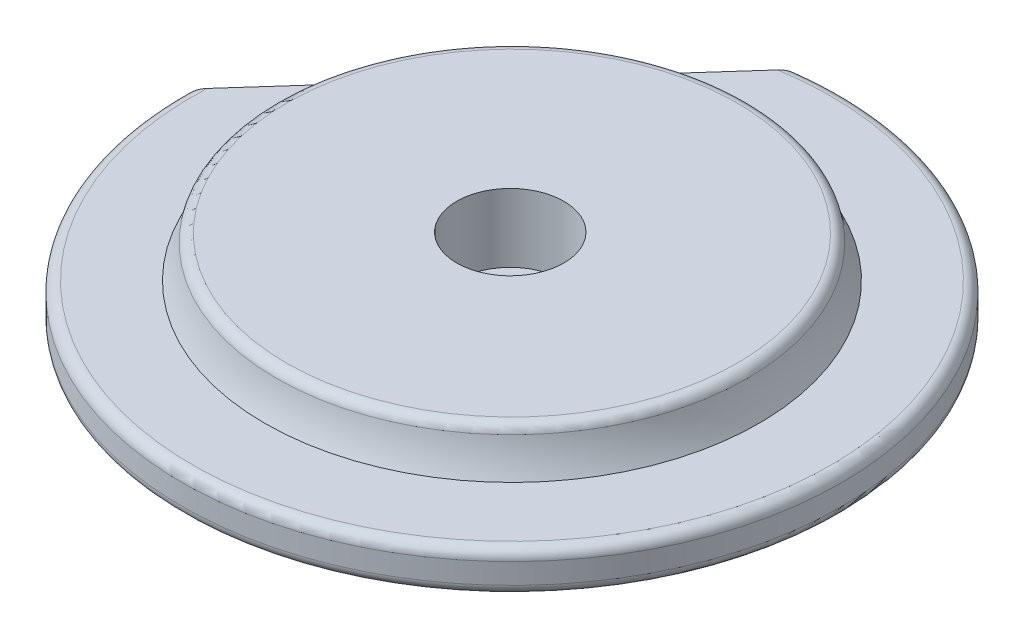
ISO-10303-21;
HEADER;
FILE_DESCRIPTION(('STEP AP214'),'2;1');
FILE_NAME('part.step','',(''),(''),'','','');
FILE_SCHEMA(('AUTOMOTIVE_DESIGN { 1 0 10303 214 1 1 1 1 }'));
ENDSEC;
DATA;
#1=APPLICATION_CONTEXT('core data for automotive mechanical design processes');
#2=APPLICATION_PROTOCOL_DEFINITION('international standard','automotive_design',2000,#1);
#3=PRODUCT_CONTEXT('',#1,'mechanical');
#4=PRODUCT('Part','Part','',(#3));
#5=PRODUCT_RELATED_PRODUCT_CATEGORY('part','',(#4));
#6=PRODUCT_DEFINITION_FORMATION('','',#4);
#7=PRODUCT_DEFINITION_CONTEXT('part definition',#1,'design');
#8=PRODUCT_DEFINITION('design','',#6,#7);
#9=PRODUCT_DEFINITION_SHAPE('','',#8);
#10=(LENGTH_UNIT() NAMED_UNIT(*) SI_UNIT(.MILLI.,.METRE.));
#11=(NAMED_UNIT(*) PLANE_ANGLE_UNIT() SI_UNIT($,.RADIAN.));
#12=(NAMED_UNIT(*) SI_UNIT($,.STERADIAN.) SOLID_ANGLE_UNIT());
#13=UNCERTAINTY_MEASURE_WITH_UNIT(LENGTH_MEASURE(1.E-05),#10,'distance_accuracy_value','');
#14=(GEOMETRIC_REPRESENTATION_CONTEXT(3) GLOBAL_UNCERTAINTY_ASSIGNED_CONTEXT((#13)) GLOBAL_UNIT_ASSIGNED_CONTEXT((#10,
#11,#12)) REPRESENTATION_CONTEXT('',''));
#15=CARTESIAN_POINT('',(0.,0.,0.));
#16=DIRECTION('',(0.,0.,1.));
#17=DIRECTION('',(1.,0.,0.));
#18=AXIS2_PLACEMENT_3D('',#15,#16,#17);
#19=CARTESIAN_POINT('',(81.9281874125754,11.3854877690366,1.71360669660462));
#20=DIRECTION('',(0.,1.,0.));
#21=DIRECTION('',(0.,0.,1.));
#22=AXIS2_PLACEMENT_3D('',#19,#20,#21);
#23=CYLINDRICAL_SURFACE('',#22,20.);
#24=DIRECTION('',(0.,1.,0.));
#25=VECTOR('',#24,1.);
#26=CARTESIAN_POINT('',(79.5576123445659,6.38523776903659,-18.1454057120458));
#27=LINE('',#26,#25);
#28=CARTESIAN_POINT('',(79.5576123445659,7.01048776903659,-18.1454057120458));
#29=VERTEX_POINT('',#28);
#30=CARTESIAN_POINT('',(79.5576123445659,8.26048776903659,-18.1454057120458));
#31=VERTEX_POINT('',#30);
#32=EDGE_CURVE('E85',#29,#31,#27,.T.);
#33=ORIENTED_EDGE('',*,*,#32,.T.);
#34=CARTESIAN_POINT('',(81.9281874125754,8.26048776903659,1.71360669660462));
#35=DIRECTION('',(0.,1.,0.));
#36=DIRECTION('',(0.,0.,1.));
#37=AXIS2_PLACEMENT_3D('',#34,#35,#36);
#38=CIRCLE('',#37,20.);
#39=CARTESIAN_POINT('',(61.9286124853362,8.26048776903659,1.58321218083465));
#40=VERTEX_POINT('',#39);
#41=EDGE_CURVE('E90',#31,#40,#38,.F.);
#42=ORIENTED_EDGE('',*,*,#41,.T.);
#43=DIRECTION('',(0.,1.,0.));
#44=VECTOR('',#43,1.);
#45=CARTESIAN_POINT('',(61.9286124853362,6.38523776903659,1.58321218083466));
#46=LINE('',#45,#44);
#47=CARTESIAN_POINT('',(61.9286124853362,7.01048776903659,1.58321218083465));
#48=VERTEX_POINT('',#47);
#49=EDGE_CURVE('E75',#48,#40,#46,.T.);
#50=ORIENTED_EDGE('',*,*,#49,.F.);
#51=CARTESIAN_POINT('',(81.9281874125754,7.01048776903659,1.71360669660462));
#52=DIRECTION('',(0.,-1.,0.));
#53=DIRECTION('',(0.,0.,-1.));
#54=AXIS2_PLACEMENT_3D('',#51,#52,#53);
#55=CIRCLE('',#54,20.);
#56=EDGE_CURVE('E94',#48,#29,#55,.F.);
#57=ORIENTED_EDGE('',*,*,#56,.T.);
#58=EDGE_LOOP('',(#33,#42,#50,#57));
#59=FACE_BOUND('',#58,.T.);
#60=ADVANCED_FACE('F35',(#59),#23,.T.);
#61=CARTESIAN_POINT('',(61.9281874125754,6.38548776903659,1.71360669660462));
#62=DIRECTION('',(0.,-1.,0.));
#63=DIRECTION('',(0.,0.,-1.));
#64=AXIS2_PLACEMENT_3D('',#61,#62,#63);
#65=PLANE('',#64);
#66=CARTESIAN_POINT('',(81.8259598066725,6.38548776903659,1.71360669660462));
#67=DIRECTION('',(0.,1.,0.));
#68=DIRECTION('',(0.,0.,1.));
#69=AXIS2_PLACEMENT_3D('',#66,#67,#68);
#70=CIRCLE('',#69,2.1875);
#71=CARTESIAN_POINT('',(81.8259598066725,6.38548776903659,3.90110669660461));
#72=VERTEX_POINT('',#71);
#73=EDGE_CURVE('E149',#72,#72,#70,.T.);
#74=ORIENTED_EDGE('',*,*,#73,.T.);
#75=EDGE_LOOP('',(#74));
#76=FACE_BOUND('',#75,.T.);
#77=DIRECTION('',(0.666313564147347,0.,-0.745671666508296));
#78=VECTOR('',#77,1.);
#79=CARTESIAN_POINT('',(61.9286124853362,6.38548776903659,1.58321218083466));
#80=LINE('',#79,#78);
#81=CARTESIAN_POINT('',(62.5718522846367,6.38548776903659,0.863362369998708));
#82=VERTEX_POINT('',#81);
#83=CARTESIAN_POINT('',(78.9143725452653,6.38548776903659,-17.4255559012099));
#84=VERTEX_POINT('',#83);
#85=EDGE_CURVE('E107',#82,#84,#80,.T.);
#86=ORIENTED_EDGE('',*,*,#85,.T.);
#87=CARTESIAN_POINT('',(81.9281874125754,6.38548776903659,1.71360669660462));
#88=DIRECTION('',(0.,-1.,0.));
#89=DIRECTION('',(0.,0.,-1.));
#90=AXIS2_PLACEMENT_3D('',#87,#88,#89);
#91=CIRCLE('',#90,19.375);
#92=EDGE_CURVE('E43',#84,#82,#91,.T.);
#93=ORIENTED_EDGE('',*,*,#92,.T.);
#94=EDGE_LOOP('',(#86,#93));
#95=FACE_BOUND('',#94,.T.);
#96=ADVANCED_FACE('F106',(#76,#95),#65,.T.);
#97=CARTESIAN_POINT('',(67.7289679316518,11.3854877690366,1.71360669660462));
#98=DIRECTION('',(0.,1.,0.));
#99=DIRECTION('',(0.,0.,1.));
#100=AXIS2_PLACEMENT_3D('',#97,#98,#99);
#101=PLANE('',#100);
#102=CARTESIAN_POINT('',(81.8259598066725,11.3854877690366,1.71360669660462));
#103=DIRECTION('',(0.,1.,0.));
#104=DIRECTION('',(0.,0.,1.));
#105=AXIS2_PLACEMENT_3D('',#102,#103,#104);
#106=CIRCLE('',#105,3.25);
#107=CARTESIAN_POINT('',(81.8259598066725,11.3854877690366,4.96360669660462));
#108=VERTEX_POINT('',#107);
#109=EDGE_CURVE('E158',#108,#108,#106,.T.);
#110=ORIENTED_EDGE('',*,*,#109,.F.);
#111=EDGE_LOOP('',(#110));
#112=FACE_BOUND('',#111,.T.);
#113=CARTESIAN_POINT('',(81.9281874125754,11.3854877690366,1.71360669660462));
#114=DIRECTION('',(0.,1.,0.));
#115=DIRECTION('',(0.,0.,1.));
#116=AXIS2_PLACEMENT_3D('',#113,#114,#115);
#117=CIRCLE('',#116,13.6727916926659);
#118=CARTESIAN_POINT('',(81.9281874125754,11.3854877690366,15.3863983892705));
#119=VERTEX_POINT('',#118);
#120=EDGE_CURVE('E99',#119,#119,#117,.T.);
#121=ORIENTED_EDGE('',*,*,#120,.T.);
#122=EDGE_LOOP('',(#121));
#123=FACE_BOUND('',#122,.T.);
#124=ADVANCED_FACE('F164',(#112,#123),#101,.T.);
#125=CARTESIAN_POINT('',(81.9281874125754,12.426222627753,1.71360669660462));
#126=DIRECTION('',(0.,1.,0.));
#127=DIRECTION('',(0.,0.,1.));
#128=AXIS2_PLACEMENT_3D('',#125,#126,#127);
#129=TOROIDAL_SURFACE('',#128,21.7511787538993,7.62333377905169);
#130=CARTESIAN_POINT('',(81.9281874125754,10.8867052954589,1.71360669660462));
#131=DIRECTION('',(0.,1.,0.));
#132=DIRECTION('',(0.,0.,1.));
#133=AXIS2_PLACEMENT_3D('',#130,#131,#132);
#134=CIRCLE('',#133,14.2849143405265);
#135=CARTESIAN_POINT('',(81.9281874125754,10.8867052954589,15.9985210371311));
#136=VERTEX_POINT('',#135);
#137=EDGE_CURVE('E95',#136,#136,#134,.F.);
#138=ORIENTED_EDGE('',*,*,#137,.T.);
#139=EDGE_LOOP('',(#138));
#140=FACE_BOUND('',#139,.T.);
#141=CARTESIAN_POINT('',(81.9281874125754,8.88548776903659,1.71360669660462));
#142=DIRECTION('',(0.,1.,0.));
#143=DIRECTION('',(0.,0.,1.));
#144=AXIS2_PLACEMENT_3D('',#141,#142,#143);
#145=CIRCLE('',#144,15.);
#146=CARTESIAN_POINT('',(70.743112414951,8.88548776903659,-8.28109676560558));
#147=VERTEX_POINT('',#146);
#148=EDGE_CURVE('E112',#147,#147,#145,.T.);
#149=ORIENTED_EDGE('',*,*,#148,.T.);
#150=EDGE_LOOP('',(#149));
#151=FACE_BOUND('',#150,.T.);
#152=ADVANCED_FACE('F167',(#140,#151),#129,.F.);
#153=CARTESIAN_POINT('',(61.9281874125754,8.88548776903659,1.71360669660462));
#154=DIRECTION('',(0.,1.,0.));
#155=DIRECTION('',(0.,0.,1.));
#156=AXIS2_PLACEMENT_3D('',#153,#154,#155);
#157=PLANE('',#156);
#158=DIRECTION('',(0.666313564147347,0.,-0.745671666508296));
#159=VECTOR('',#158,1.);
#160=CARTESIAN_POINT('',(61.9286124853362,8.88548776903659,1.58321218083466));
#161=LINE('',#160,#159);
#162=CARTESIAN_POINT('',(62.5718522846367,8.88548776903659,0.863362369998708));
#163=VERTEX_POINT('',#162);
#164=EDGE_CURVE('E55',#163,#147,#161,.T.);
#165=ORIENTED_EDGE('',*,*,#164,.F.);
#166=CARTESIAN_POINT('',(81.9281874125754,8.88548776903659,1.71360669660462));
#167=DIRECTION('',(0.,1.,0.));
#168=DIRECTION('',(0.,0.,1.));
#169=AXIS2_PLACEMENT_3D('',#166,#167,#168);
#170=CIRCLE('',#169,19.375);
#171=CARTESIAN_POINT('',(78.9143725452653,8.88548776903659,-17.4255559012099));
#172=VERTEX_POINT('',#171);
#173=EDGE_CURVE('E11',#163,#172,#170,.T.);
#174=ORIENTED_EDGE('',*,*,#173,.T.);
#175=EDGE_CURVE('E50',#147,#172,#161,.T.);
#176=ORIENTED_EDGE('',*,*,#175,.F.);
#177=ORIENTED_EDGE('',*,*,#148,.F.);
#178=EDGE_LOOP('',(#165,#174,#176,#177));
#179=FACE_BOUND('',#178,.T.);
#180=ADVANCED_FACE('F174',(#179),#157,.T.);
#181=CARTESIAN_POINT('',(81.9281874125754,10.7604877690366,1.71360669660462));
#182=DIRECTION('',(0.,-1.,0.));
#183=DIRECTION('',(0.,0.,-1.));
#184=AXIS2_PLACEMENT_3D('',#181,#182,#183);
#185=TOROIDAL_SURFACE('',#184,13.6727916926659,0.625);
#186=ORIENTED_EDGE('',*,*,#137,.F.);
#187=EDGE_LOOP('',(#186));
#188=FACE_BOUND('',#187,.T.);
#189=ORIENTED_EDGE('',*,*,#120,.F.);
#190=EDGE_LOOP('',(#189));
#191=FACE_BOUND('',#190,.T.);
#192=ADVANCED_FACE('F172',(#188,#191),#185,.T.);
#193=CARTESIAN_POINT('',(81.9281874125754,7.01048776903659,1.71360669660462));
#194=DIRECTION('',(0.,-1.,0.));
#195=DIRECTION('',(0.,0.,-1.));
#196=AXIS2_PLACEMENT_3D('',#193,#194,#195);
#197=TOROIDAL_SURFACE('',#196,19.375,0.625);
#198=CARTESIAN_POINT('',(61.9286124873509,7.01053776903659,1.58321217857996));
#199=CARTESIAN_POINT('',(61.9286093607359,6.99707171657051,1.58321567757556));
#200=CARTESIAN_POINT('',(61.9290491276123,6.98361440718947,1.58272353436066));
#201=CARTESIAN_POINT('',(61.9307913530221,6.95683835746495,1.58077380949436));
#202=CARTESIAN_POINT('',(61.9320930136547,6.94351950052076,1.57931712077393));
#203=CARTESIAN_POINT('',(61.9372210958283,6.90419367831117,1.57357828280616));
#204=CARTESIAN_POINT('',(61.9422716969417,6.87852838117262,1.56792615391105));
#205=CARTESIAN_POINT('',(61.9552088684401,6.82900897026337,1.55344816224138));
#206=CARTESIAN_POINT('',(61.9630860289638,6.80514916127897,1.54463283004481));
#207=CARTESIAN_POINT('',(61.9811791272211,6.75946815898972,1.52438483952542));
#208=CARTESIAN_POINT('',(61.9914010972561,6.73765243183012,1.51294543045271));
#209=CARTESIAN_POINT('',(62.0187986028414,6.68676797937501,1.48228487550187));
#210=CARTESIAN_POINT('',(62.0370130391596,6.65896213622447,1.46190109553003));
#211=CARTESIAN_POINT('',(62.0761309334243,6.60802671539272,1.41812425084878));
#212=CARTESIAN_POINT('',(62.0970398003791,6.58490679155398,1.39472513291706));
#213=CARTESIAN_POINT('',(62.1513183946213,6.53278698420585,1.33398194532175));
#214=CARTESIAN_POINT('',(62.1857996406402,6.50640264697178,1.29539397478407));
#215=CARTESIAN_POINT('',(62.2570328751614,6.46197137713223,1.21567684526083));
#216=CARTESIAN_POINT('',(62.2937885179884,6.44393827883589,1.17454359671967));
#217=CARTESIAN_POINT('',(62.3839853196164,6.40932832244544,1.07360433478271));
#218=CARTESIAN_POINT('',(62.4380541425482,6.39642169620427,1.01309590231022));
#219=CARTESIAN_POINT('',(62.5469053391215,6.38373618392352,0.891280502598029));
#220=CARTESIAN_POINT('',(62.6016890276075,6.38398642812186,0.829972063915601));
#221=CARTESIAN_POINT('',(62.711683136799,6.39735739476595,0.706877630423292));
#222=CARTESIAN_POINT('',(62.7668813803063,6.41072647568338,0.645105263118974));
#223=CARTESIAN_POINT('',(62.8478034682623,6.4412515596483,0.554545335435752));
#224=CARTESIAN_POINT('',(62.8744372438076,6.45315337947619,0.524739470952661));
#225=CARTESIAN_POINT('',(62.9268235973366,6.48069699628847,0.466113890384878));
#226=CARTESIAN_POINT('',(62.9525769339926,6.49633547554801,0.437293325270047));
#227=CARTESIAN_POINT('',(63.0025704539415,6.53153802408631,0.38134556532522));
#228=CARTESIAN_POINT('',(63.0268229399856,6.55106234192682,0.35420460248345));
#229=CARTESIAN_POINT('',(63.0734871200405,6.59461383046691,0.301982707597805));
#230=CARTESIAN_POINT('',(63.0959000408214,6.61863796465442,0.276900402675241));
#231=CARTESIAN_POINT('',(63.1336616071099,6.6663642948521,0.234641424951445));
#232=CARTESIAN_POINT('',(63.1495217078668,6.68914658733982,0.216892382460519));
#233=CARTESIAN_POINT('',(63.1786876632174,6.73816617944378,0.184252754961105));
#234=CARTESIAN_POINT('',(63.1919978156389,6.76439753766561,0.16935736025257));
#235=CARTESIAN_POINT('',(63.2118576488495,6.81258212136564,0.147132216230967));
#236=CARTESIAN_POINT('',(63.2192604974193,6.83373956810518,0.138847686653621));
#237=CARTESIAN_POINT('',(63.2316746691177,6.87755810260929,0.124954984183208));
#238=CARTESIAN_POINT('',(63.2366923190732,6.9002150287901,0.119339730936683));
#239=CARTESIAN_POINT('',(63.2425368249673,6.9376119431301,0.112799143014668));
#240=CARTESIAN_POINT('',(63.2442329865327,6.95205328381843,0.110900968207522));
#241=CARTESIAN_POINT('',(63.2465121510954,6.98117108122951,0.1083503546088));
#242=CARTESIAN_POINT('',(63.2470921246158,6.99584806910843,0.107701306105524));
#243=CARTESIAN_POINT('',(63.2470848160723,7.01053776903659,0.107709485098354));
#244=B_SPLINE_CURVE_WITH_KNOTS('',3,(#198,#199,#200,#201,#202,#203,#204,#205,#206,#207,#208,
#209,#210,#211,#212,#213,#214,#215,#216,#217,#218,#219,#220,#221,#222,#223,#224,#225,#226,#227,
#228,#229,#230,#231,#232,#233,#234,#235,#236,#237,#238,#239,#240,#241,#242,#243),.UNSPECIFIED.,
.F.,.F.,(4,2,2,2,2,2,2,2,2,2,2,2,2,2,2,2,2,2,2,2,2,2,4),(0.,0.0403653506476043,
0.0806933850950652,0.160496503520401,0.240036378409684,0.319783220713375,0.436107935093126,
0.552669916532418,0.725967851358157,0.899551846266838,1.14475080501186,1.39049267433679,
1.64097834493061,1.76595199890698,1.89081510026967,2.0144610726113,2.13802390631763,
2.23656583949488,2.33494019443706,2.4063732154157,2.47761568552607,2.52151719230926,
2.5655376862727),.UNSPECIFIED.);
#245=EDGE_CURVE('E80',#48,#82,#244,.T.);
#246=ORIENTED_EDGE('',*,*,#245,.T.);
#247=ORIENTED_EDGE('',*,*,#92,.F.);
#248=CARTESIAN_POINT('',(78.2391400138297,7.01053776903659,-16.6699030163095));
#249=CARTESIAN_POINT('',(78.2391359974517,6.9976240448801,-16.6698985215799));
#250=CARTESIAN_POINT('',(78.2395826072528,6.98471990764128,-16.6703983227135));
#251=CARTESIAN_POINT('',(78.2413467035968,6.95906299386646,-16.6723725233474));
#252=CARTESIAN_POINT('',(78.242663046538,6.94631004092498,-16.6738456430427));
#253=CARTESIAN_POINT('',(78.2478275005938,6.90875592813725,-16.6796251847924));
#254=CARTESIAN_POINT('',(78.2528927781673,6.88431536686879,-16.6852937381176));
#255=CARTESIAN_POINT('',(78.2657479766343,6.83730286347667,-16.6996799937484));
#256=CARTESIAN_POINT('',(78.2735246682194,6.81472249487693,-16.7083828911322));
#257=CARTESIAN_POINT('',(78.2912569134942,6.77151081136815,-16.728227050994));
#258=CARTESIAN_POINT('',(78.3012198140686,6.75088641261307,-16.7393765353723));
#259=CARTESIAN_POINT('',(78.3288934838946,6.70066123480331,-16.7703461457898));
#260=CARTESIAN_POINT('',(78.347805207785,6.67255702419344,-16.791510260448));
#261=CARTESIAN_POINT('',(78.388270866033,6.62106543308666,-16.8367953881203));
#262=CARTESIAN_POINT('',(78.4098305278359,6.59768857720758,-16.8609228107196));
#263=CARTESIAN_POINT('',(78.4678366637423,6.54268904006992,-16.925837491069));
#264=CARTESIAN_POINT('',(78.5056151887975,6.51423988420165,-16.9681154473525));
#265=CARTESIAN_POINT('',(78.5835892630755,6.46629446699406,-17.0553762522346));
#266=CARTESIAN_POINT('',(78.6237896713125,6.4468169308848,-17.100364538557));
#267=CARTESIAN_POINT('',(78.7203784399154,6.4102740313368,-17.2084570522405));
#268=CARTESIAN_POINT('',(78.7773483677004,6.39664762632179,-17.2722121118372));
#269=CARTESIAN_POINT('',(78.8920061301959,6.38347757907456,-17.40052564084));
#270=CARTESIAN_POINT('',(78.9496942030596,6.38393874005524,-17.4650843767633));
#271=CARTESIAN_POINT('',(79.0530835927461,6.39804031485497,-17.5807874671025));
#272=CARTESIAN_POINT('',(79.0989420865443,6.40911032240996,-17.6321077183086));
#273=CARTESIAN_POINT('',(79.188951305099,6.44178568650412,-17.7328370559841));
#274=CARTESIAN_POINT('',(79.2331058580292,6.46336573946908,-17.7822504265637));
#275=CARTESIAN_POINT('',(79.3023905447089,6.508535769812,-17.8597869357387));
#276=CARTESIAN_POINT('',(79.3285709711393,6.52850218069123,-17.8890854571206));
#277=CARTESIAN_POINT('',(79.3787698401179,6.57388813503226,-17.945263023213));
#278=CARTESIAN_POINT('',(79.4027908266608,6.59930113922553,-17.9721449149085));
#279=CARTESIAN_POINT('',(79.44185468414,6.64892396594116,-18.0158612870103));
#280=CARTESIAN_POINT('',(79.4576340260683,6.67182099347677,-18.0335199522772));
#281=CARTESIAN_POINT('',(79.4866142251323,6.7210606846777,-18.0659516998726));
#282=CARTESIAN_POINT('',(79.4998185525214,6.74739863002735,-18.0807286657624));
#283=CARTESIAN_POINT('',(79.5203205386987,6.79736868786108,-18.1036724433203));
#284=CARTESIAN_POINT('',(79.5282769975022,6.82038955545227,-18.1125765182405));
#285=CARTESIAN_POINT('',(79.5415450550579,6.8680714392168,-18.1274248045747));
#286=CARTESIAN_POINT('',(79.5468625285176,6.89272867253286,-18.1333755903754));
#287=CARTESIAN_POINT('',(79.5529540513009,6.93306424506878,-18.1401926149563));
#288=CARTESIAN_POINT('',(79.5546936645238,6.94842408051148,-18.1421394165236));
#289=CARTESIAN_POINT('',(79.5570268180959,6.97936437554525,-18.1447504492355));
#290=CARTESIAN_POINT('',(79.5576183919461,6.99494516772738,-18.1454124796705));
#291=CARTESIAN_POINT('',(79.5576123425511,7.01053776903659,-18.1454057097911));
#292=B_SPLINE_CURVE_WITH_KNOTS('',3,(#248,#249,#250,#251,#252,#253,#254,#255,#256,#257,#258,
#259,#260,#261,#262,#263,#264,#265,#266,#267,#268,#269,#270,#271,#272,#273,#274,#275,#276,#277,
#278,#279,#280,#281,#282,#283,#284,#285,#286,#287,#288,#289,#290,#291),.UNSPECIFIED.,.F.,.F.,(4,
2,2,2,2,2,2,2,2,2,2,2,2,2,2,2,2,2,2,2,2,4),(0.,0.038705873819418,0.0773609547614569,
0.153657416906404,0.229586711965052,0.305775189980388,0.424927080284437,0.544341389477442,
0.733595494874202,0.923242834195664,1.18169553587798,1.44023635904286,1.64869235948103,
1.85664895196269,1.98852664530184,2.12024688234748,2.21874900690119,2.31711745217275,
2.39461843682227,2.47194611203152,2.51859716561446,2.56532805841342),.UNSPECIFIED.);
#293=EDGE_CURVE('E111',#84,#29,#292,.T.);
#294=ORIENTED_EDGE('',*,*,#293,.T.);
#295=ORIENTED_EDGE('',*,*,#56,.F.);
#296=EDGE_LOOP('',(#246,#247,#294,#295));
#297=FACE_BOUND('',#296,.T.);
#298=ADVANCED_FACE('F110',(#297),#197,.T.);
#299=CARTESIAN_POINT('',(81.9281874125754,8.26048776903659,1.71360669660462));
#300=DIRECTION('',(0.,1.,0.));
#301=DIRECTION('',(0.,0.,1.));
#302=AXIS2_PLACEMENT_3D('',#299,#300,#301);
#303=TOROIDAL_SURFACE('',#302,19.375,0.625);
#304=CARTESIAN_POINT('',(63.2470848160723,8.26043776903659,0.10770948509835));
#305=CARTESIAN_POINT('',(63.2470888324503,8.27335149319308,0.107704990368783));
#306=CARTESIAN_POINT('',(63.2466422226492,8.2862556304319,0.10820479150233));
#307=CARTESIAN_POINT('',(63.2448781263052,8.31191254420672,0.110178992136207));
#308=CARTESIAN_POINT('',(63.243561783364,8.3246654971482,0.111652111831578));
#309=CARTESIAN_POINT('',(63.2383973293083,8.36221960993593,0.117431653581279));
#310=CARTESIAN_POINT('',(63.2333320517347,8.38666017120439,0.1231002069064));
#311=CARTESIAN_POINT('',(63.2204768532677,8.43367267459651,0.137486462537257));
#312=CARTESIAN_POINT('',(63.2127001616826,8.45625304319625,0.146189359921002));
#313=CARTESIAN_POINT('',(63.1949679164078,8.49946472670504,0.166033519782849));
#314=CARTESIAN_POINT('',(63.1850050158334,8.52008912546011,0.177183004161183));
#315=CARTESIAN_POINT('',(63.1573313460074,8.57031430326986,0.208152614578673));
#316=CARTESIAN_POINT('',(63.138419622117,8.59841851387974,0.229316729236904));
#317=CARTESIAN_POINT('',(63.097953963869,8.64991010498652,0.274601856909133));
#318=CARTESIAN_POINT('',(63.0763943020661,8.6732869608656,0.298729279508476));
#319=CARTESIAN_POINT('',(63.0183881661597,8.72828649800327,0.363643959857867));
#320=CARTESIAN_POINT('',(62.9806096411045,8.75673565387153,0.405921916141393));
#321=CARTESIAN_POINT('',(62.9026355668265,8.80468107107912,0.493182721023412));
#322=CARTESIAN_POINT('',(62.8624351585895,8.82415860718839,0.538171007345843));
#323=CARTESIAN_POINT('',(62.7658463899866,8.86070150673637,0.646263521029384));
#324=CARTESIAN_POINT('',(62.7088764622016,8.87432791175139,0.710018580626081));
#325=CARTESIAN_POINT('',(62.5942186997061,8.88749795899862,0.838332109628831));
#326=CARTESIAN_POINT('',(62.5365306268424,8.88703679801794,0.90289084555211));
#327=CARTESIAN_POINT('',(62.433141237156,8.87293522321821,1.01859393589132));
#328=CARTESIAN_POINT('',(62.3872827433577,8.86186521566322,1.06991418709747));
#329=CARTESIAN_POINT('',(62.297273524803,8.82918985156906,1.17064352477299));
#330=CARTESIAN_POINT('',(62.2531189718728,8.8076097986041,1.22005689535258));
#331=CARTESIAN_POINT('',(62.1838342851931,8.76243976826118,1.29759340452758));
#332=CARTESIAN_POINT('',(62.1576538587627,8.74247335738194,1.32689192590948));
#333=CARTESIAN_POINT('',(62.1074549897841,8.69708740304091,1.38306949200184));
#334=CARTESIAN_POINT('',(62.0834340032412,8.67167439884765,1.40995138369736));
#335=CARTESIAN_POINT('',(62.0443701457619,8.62205157213201,1.4536677557992));
#336=CARTESIAN_POINT('',(62.0285908038337,8.59915454459641,1.47132642106605));
#337=CARTESIAN_POINT('',(61.9996106047697,8.54991485339547,1.50375816866145));
#338=CARTESIAN_POINT('',(61.9864062773806,8.52357690804582,1.51853513455129));
#339=CARTESIAN_POINT('',(61.9659042912033,8.47360685021209,1.54147891210913));
#340=CARTESIAN_POINT('',(61.9579478323998,8.4505859826209,1.55038298702932));
#341=CARTESIAN_POINT('',(61.9446797748441,8.40290409885637,1.56523127336357));
#342=CARTESIAN_POINT('',(61.9393623013844,8.37824686554032,1.57118205916427));
#343=CARTESIAN_POINT('',(61.9332707786011,8.3379112930044,1.5779990837452));
#344=CARTESIAN_POINT('',(61.9315311653782,8.3225514575617,1.57994588531241));
#345=CARTESIAN_POINT('',(61.9291980118061,8.29161116252793,1.58255691802432));
#346=CARTESIAN_POINT('',(61.9286064379559,8.2760303703458,1.58321894845936));
#347=CARTESIAN_POINT('',(61.9286124873509,8.26043776903659,1.58321217857996));
#348=B_SPLINE_CURVE_WITH_KNOTS('',3,(#304,#305,#306,#307,#308,#309,#310,#311,#312,#313,#314,
#315,#316,#317,#318,#319,#320,#321,#322,#323,#324,#325,#326,#327,#328,#329,#330,#331,#332,#333,
#334,#335,#336,#337,#338,#339,#340,#341,#342,#343,#344,#345,#346,#347),.UNSPECIFIED.,.F.,.F.,(4,
2,2,2,2,2,2,2,2,2,2,2,2,2,2,2,2,2,2,2,2,4),(0.,0.0387058738194172,0.0773609547614557,
0.153657416906405,0.229586711965056,0.305775189980389,0.424927080284442,0.544341389477446,
0.73359549487421,0.923242834195677,1.18169553587798,1.44023635904286,1.64869235948103,
1.85664895196269,1.98852664530183,2.12024688234749,2.21874900690119,2.31711745217275,
2.39461843682227,2.47194611203152,2.51859716561446,2.56532805841342),.UNSPECIFIED.);
#349=EDGE_CURVE('E78',#163,#40,#348,.T.);
#350=ORIENTED_EDGE('',*,*,#349,.T.);
#351=ORIENTED_EDGE('',*,*,#41,.F.);
#352=CARTESIAN_POINT('',(79.5576123425511,8.26043776903659,-18.1454057097911));
#353=CARTESIAN_POINT('',(79.5576154691661,8.27390382150267,-18.1454092087867));
#354=CARTESIAN_POINT('',(79.5571757022897,8.28736113088371,-18.1449170655718));
#355=CARTESIAN_POINT('',(79.5554334768799,8.31413718060824,-18.1429673407055));
#356=CARTESIAN_POINT('',(79.5541318162473,8.32745603755242,-18.1415106519851));
#357=CARTESIAN_POINT('',(79.5490037340737,8.36678185976201,-18.1357718140173));
#358=CARTESIAN_POINT('',(79.5439531329603,8.39244715690056,-18.1301196851222));
#359=CARTESIAN_POINT('',(79.5310159614619,8.44196656780981,-18.1156416934525));
#360=CARTESIAN_POINT('',(79.5231388009382,8.46582637679421,-18.106826361256));
#361=CARTESIAN_POINT('',(79.5050457026809,8.51150737908346,-18.0865783707366));
#362=CARTESIAN_POINT('',(79.494823732646,8.53332310624306,-18.0751389616639));
#363=CARTESIAN_POINT('',(79.4674262270606,8.58420755869817,-18.044478406713));
#364=CARTESIAN_POINT('',(79.4492117907425,8.61201340184871,-18.0240946267412));
#365=CARTESIAN_POINT('',(79.4100938964777,8.66294882268047,-17.9803177820599));
#366=CARTESIAN_POINT('',(79.3891850295229,8.6860687465192,-17.9569186641282));
#367=CARTESIAN_POINT('',(79.3349064352807,8.73818855386733,-17.8961754765329));
#368=CARTESIAN_POINT('',(79.3004251892618,8.7645728911014,-17.8575875059952));
#369=CARTESIAN_POINT('',(79.2291919547406,8.80900416094095,-17.777870376472));
#370=CARTESIAN_POINT('',(79.1924363119136,8.82703725923729,-17.7367371279308));
#371=CARTESIAN_POINT('',(79.1022395102856,8.86164721562774,-17.6357978659939));
#372=CARTESIAN_POINT('',(79.0481706873538,8.87455384186891,-17.5752894335214));
#373=CARTESIAN_POINT('',(78.9393194907805,8.88723935414966,-17.4534740338092));
#374=CARTESIAN_POINT('',(78.8845358022945,8.88698910995132,-17.3921655951267));
#375=CARTESIAN_POINT('',(78.774541693103,8.87361814330723,-17.2690711616344));
#376=CARTESIAN_POINT('',(78.7193434495958,8.8602490623898,-17.2072987943301));
#377=CARTESIAN_POINT('',(78.6384213616397,8.82972397842487,-17.1167388666469));
#378=CARTESIAN_POINT('',(78.6117875860944,8.81782215859698,-17.0869330021638));
#379=CARTESIAN_POINT('',(78.5594012325654,8.79027854178471,-17.028307421596));
#380=CARTESIAN_POINT('',(78.5336478959094,8.77464006252517,-16.9994868564812));
#381=CARTESIAN_POINT('',(78.4836543759605,8.73943751398686,-16.9435390965364));
#382=CARTESIAN_POINT('',(78.4594018899164,8.71991319614635,-16.9163981336946));
#383=CARTESIAN_POINT('',(78.4127377098615,8.67636170760627,-16.8641762388089));
#384=CARTESIAN_POINT('',(78.3903247890806,8.65233757341876,-16.8390939338864));
#385=CARTESIAN_POINT('',(78.352563222792,8.60461124322107,-16.7968349561626));
#386=CARTESIAN_POINT('',(78.3367031220352,8.58182895073335,-16.7790859136717));
#387=CARTESIAN_POINT('',(78.3075371666846,8.53280935862939,-16.7464462861722));
#388=CARTESIAN_POINT('',(78.2942270142631,8.50657800040756,-16.7315508914637));
#389=CARTESIAN_POINT('',(78.2743671810525,8.45839341670753,-16.7093257474421));
#390=CARTESIAN_POINT('',(78.2669643324827,8.43723596996799,-16.7010412178648));
#391=CARTESIAN_POINT('',(78.2545501607843,8.39341743546388,-16.6871485153944));
#392=CARTESIAN_POINT('',(78.2495325108288,8.37076050928307,-16.6815332621478));
#393=CARTESIAN_POINT('',(78.2436880049347,8.33336359494307,-16.6749926742258));
#394=CARTESIAN_POINT('',(78.2419918433693,8.31892225425475,-16.6730944994187));
#395=CARTESIAN_POINT('',(78.2397126788066,8.28980445684367,-16.6705438858199));
#396=CARTESIAN_POINT('',(78.2391327052862,8.27512746896475,-16.6698948373167));
#397=CARTESIAN_POINT('',(78.2391400138297,8.26043776903659,-16.6699030163095));
#398=B_SPLINE_CURVE_WITH_KNOTS('',3,(#352,#353,#354,#355,#356,#357,#358,#359,#360,#361,#362,
#363,#364,#365,#366,#367,#368,#369,#370,#371,#372,#373,#374,#375,#376,#377,#378,#379,#380,#381,
#382,#383,#384,#385,#386,#387,#388,#389,#390,#391,#392,#393,#394,#395,#396,#397),.UNSPECIFIED.,
.F.,.F.,(4,2,2,2,2,2,2,2,2,2,2,2,2,2,2,2,2,2,2,2,2,2,4),(0.,0.0403653506476077,
0.0806933850950647,0.160496503520401,0.240036378409684,0.319783220713377,0.436107935093127,
0.55266991653242,0.725967851358166,0.899551846266845,1.14475080501187,1.3904926743368,
1.64097834493061,1.76595199890698,1.89081510026967,2.01446107261132,2.13802390631764,
2.23656583949489,2.33494019443706,2.40637321541571,2.47761568552608,2.52151719230927,
2.5655376862727),.UNSPECIFIED.);
#399=EDGE_CURVE('E91',#31,#172,#398,.T.);
#400=ORIENTED_EDGE('',*,*,#399,.T.);
#401=ORIENTED_EDGE('',*,*,#173,.F.);
#402=EDGE_LOOP('',(#350,#351,#400,#401));
#403=FACE_BOUND('',#402,.T.);
#404=ADVANCED_FACE('F37',(#403),#303,.T.);
#405=CARTESIAN_POINT('',(61.9286124853362,6.38523776903659,1.58321218083466));
#406=DIRECTION('',(0.745671666508296,0.,0.666313564147347));
#407=DIRECTION('',(0.666313564147347,0.,-0.745671666508296));
#408=AXIS2_PLACEMENT_3D('',#405,#406,#407);
#409=PLANE('',#408);
#410=ORIENTED_EDGE('',*,*,#49,.T.);
#411=ORIENTED_EDGE('',*,*,#349,.F.);
#412=ORIENTED_EDGE('',*,*,#164,.T.);
#413=ORIENTED_EDGE('',*,*,#175,.T.);
#414=ORIENTED_EDGE('',*,*,#399,.F.);
#415=ORIENTED_EDGE('',*,*,#32,.F.);
#416=ORIENTED_EDGE('',*,*,#293,.F.);
#417=ORIENTED_EDGE('',*,*,#85,.F.);
#418=ORIENTED_EDGE('',*,*,#245,.F.);
#419=EDGE_LOOP('',(#410,#411,#412,#413,#414,#415,#416,#417,#418));
#420=FACE_BOUND('',#419,.T.);
#421=ADVANCED_FACE('F77',(#420),#409,.F.);
#422=CARTESIAN_POINT('',(81.8259598066725,11.3854877690366,1.71360669660462));
#423=DIRECTION('',(0.,1.,0.));
#424=DIRECTION('',(0.,0.,1.));
#425=AXIS2_PLACEMENT_3D('',#422,#423,#424);
#426=CYLINDRICAL_SURFACE('',#425,2.1875);
#427=ORIENTED_EDGE('',*,*,#73,.F.);
#428=EDGE_LOOP('',(#427));
#429=FACE_BOUND('',#428,.T.);
#430=CARTESIAN_POINT('',(81.8259598066725,7.23548776903659,1.71360669660462));
#431=DIRECTION('',(0.,1.,0.));
#432=DIRECTION('',(0.,0.,1.));
#433=AXIS2_PLACEMENT_3D('',#430,#431,#432);
#434=CIRCLE('',#433,2.1875);
#435=CARTESIAN_POINT('',(81.8259598066725,7.23548776903659,3.90110669660461));
#436=VERTEX_POINT('',#435);
#437=EDGE_CURVE('E152',#436,#436,#434,.T.);
#438=ORIENTED_EDGE('',*,*,#437,.T.);
#439=EDGE_LOOP('',(#438));
#440=FACE_BOUND('',#439,.T.);
#441=ADVANCED_FACE('F129',(#429,#440),#426,.F.);
#442=CARTESIAN_POINT('',(84.0134598066725,7.23548776903659,1.71360669660462));
#443=DIRECTION('',(0.,-1.,0.));
#444=DIRECTION('',(0.,0.,-1.));
#445=AXIS2_PLACEMENT_3D('',#442,#443,#444);
#446=PLANE('',#445);
#447=ORIENTED_EDGE('',*,*,#437,.F.);
#448=EDGE_LOOP('',(#447));
#449=FACE_BOUND('',#448,.T.);
#450=CARTESIAN_POINT('',(81.8259598066725,7.23548776903659,1.71360669660462));
#451=DIRECTION('',(0.,1.,0.));
#452=DIRECTION('',(0.,0.,1.));
#453=AXIS2_PLACEMENT_3D('',#450,#451,#452);
#454=CIRCLE('',#453,3.25);
#455=CARTESIAN_POINT('',(81.8259598066725,7.23548776903659,4.96360669660462));
#456=VERTEX_POINT('',#455);
#457=EDGE_CURVE('E155',#456,#456,#454,.T.);
#458=ORIENTED_EDGE('',*,*,#457,.T.);
#459=EDGE_LOOP('',(#458));
#460=FACE_BOUND('',#459,.T.);
#461=ADVANCED_FACE('F236',(#449,#460),#446,.F.);
#462=CARTESIAN_POINT('',(81.8259598066725,11.3854877690366,1.71360669660462));
#463=DIRECTION('',(0.,1.,0.));
#464=DIRECTION('',(0.,0.,1.));
#465=AXIS2_PLACEMENT_3D('',#462,#463,#464);
#466=CYLINDRICAL_SURFACE('',#465,3.25);
#467=ORIENTED_EDGE('',*,*,#457,.F.);
#468=EDGE_LOOP('',(#467));
#469=FACE_BOUND('',#468,.T.);
#470=ORIENTED_EDGE('',*,*,#109,.T.);
#471=EDGE_LOOP('',(#470));
#472=FACE_BOUND('',#471,.T.);
#473=ADVANCED_FACE('F162',(#469,#472),#466,.F.);
#474=CLOSED_SHELL('',(#60,#96,#124,#152,#180,#192,#298,#404,#421,#441,#461,#473));
#475=MANIFOLD_SOLID_BREP('B2',#474);
#476=ADVANCED_BREP_SHAPE_REPRESENTATION('',(#18,#475),#14);
#477=SHAPE_DEFINITION_REPRESENTATION(#9,#476);
ENDSEC;
END-ISO-10303-21;
